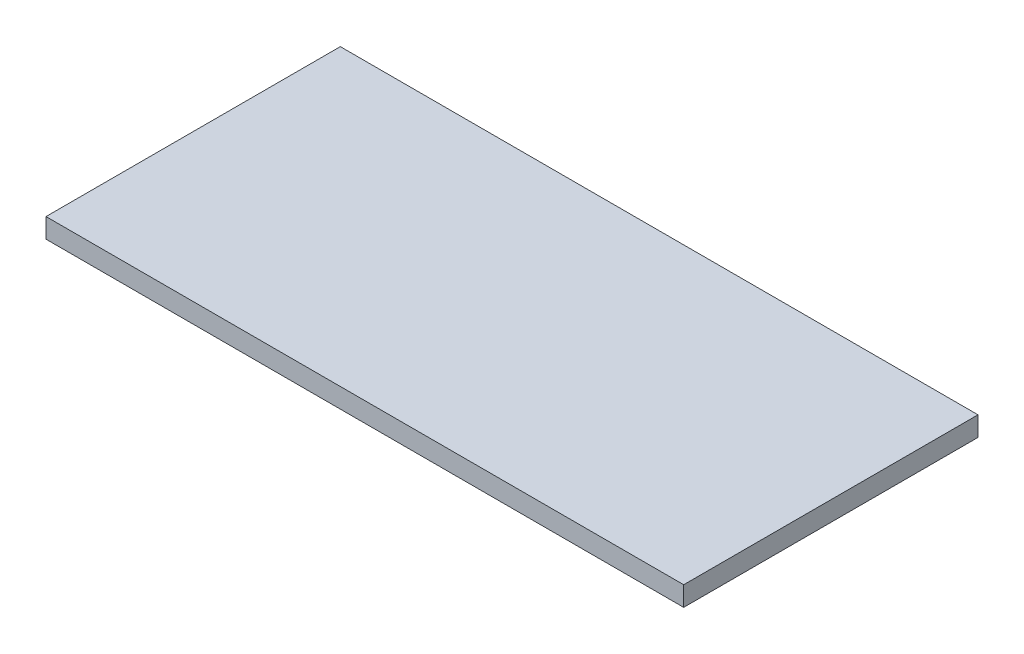
ISO-10303-21;
HEADER;
FILE_DESCRIPTION(('STEP AP214'),'2;1');
FILE_NAME('part.step','',(''),(''),'','','');
FILE_SCHEMA(('AUTOMOTIVE_DESIGN { 1 0 10303 214 1 1 1 1 }'));
ENDSEC;
DATA;
#1=APPLICATION_CONTEXT('core data for automotive mechanical design processes');
#2=APPLICATION_PROTOCOL_DEFINITION('international standard','automotive_design',2000,#1);
#3=PRODUCT_CONTEXT('',#1,'mechanical');
#4=PRODUCT('Part','Part','',(#3));
#5=PRODUCT_RELATED_PRODUCT_CATEGORY('part','',(#4));
#6=PRODUCT_DEFINITION_FORMATION('','',#4);
#7=PRODUCT_DEFINITION_CONTEXT('part definition',#1,'design');
#8=PRODUCT_DEFINITION('design','',#6,#7);
#9=PRODUCT_DEFINITION_SHAPE('','',#8);
#10=(LENGTH_UNIT() NAMED_UNIT(*) SI_UNIT(.MILLI.,.METRE.));
#11=(NAMED_UNIT(*) PLANE_ANGLE_UNIT() SI_UNIT($,.RADIAN.));
#12=(NAMED_UNIT(*) SI_UNIT($,.STERADIAN.) SOLID_ANGLE_UNIT());
#13=UNCERTAINTY_MEASURE_WITH_UNIT(LENGTH_MEASURE(1.E-05),#10,'distance_accuracy_value','');
#14=(GEOMETRIC_REPRESENTATION_CONTEXT(3) GLOBAL_UNCERTAINTY_ASSIGNED_CONTEXT((#13)) GLOBAL_UNIT_ASSIGNED_CONTEXT((#10,
#11,#12)) REPRESENTATION_CONTEXT('',''));
#15=CARTESIAN_POINT('',(0.,0.,0.));
#16=DIRECTION('',(0.,0.,1.));
#17=DIRECTION('',(1.,0.,0.));
#18=AXIS2_PLACEMENT_3D('',#15,#16,#17);
#19=CARTESIAN_POINT('',(0.,2.,0.));
#20=DIRECTION('',(-1.,0.,0.));
#21=DIRECTION('',(0.,0.,1.));
#22=AXIS2_PLACEMENT_3D('',#19,#20,#21);
#23=PLANE('',#22);
#24=DIRECTION('',(0.,0.,-1.));
#25=VECTOR('',#24,1.);
#26=CARTESIAN_POINT('',(0.,0.,0.));
#27=LINE('',#26,#25);
#28=CARTESIAN_POINT('',(0.,0.,30.));
#29=VERTEX_POINT('',#28);
#30=CARTESIAN_POINT('',(0.,0.,0.));
#31=VERTEX_POINT('',#30);
#32=EDGE_CURVE('E96',#29,#31,#27,.T.);
#33=ORIENTED_EDGE('',*,*,#32,.T.);
#34=DIRECTION('',(0.,-1.,0.));
#35=VECTOR('',#34,1.);
#36=CARTESIAN_POINT('',(0.,2.,0.));
#37=LINE('',#36,#35);
#38=CARTESIAN_POINT('',(0.,2.,0.));
#39=VERTEX_POINT('',#38);
#40=EDGE_CURVE('E11',#39,#31,#37,.T.);
#41=ORIENTED_EDGE('',*,*,#40,.F.);
#42=DIRECTION('',(0.,0.,-1.));
#43=VECTOR('',#42,1.);
#44=CARTESIAN_POINT('',(0.,2.,0.));
#45=LINE('',#44,#43);
#46=CARTESIAN_POINT('',(0.,2.,30.));
#47=VERTEX_POINT('',#46);
#48=EDGE_CURVE('E84',#47,#39,#45,.T.);
#49=ORIENTED_EDGE('',*,*,#48,.F.);
#50=DIRECTION('',(0.,-1.,0.));
#51=VECTOR('',#50,1.);
#52=CARTESIAN_POINT('',(0.,2.,30.));
#53=LINE('',#52,#51);
#54=EDGE_CURVE('E92',#47,#29,#53,.T.);
#55=ORIENTED_EDGE('',*,*,#54,.T.);
#56=EDGE_LOOP('',(#33,#41,#49,#55));
#57=FACE_BOUND('',#56,.T.);
#58=ADVANCED_FACE('F33',(#57),#23,.F.);
#59=CARTESIAN_POINT('',(0.,2.,0.));
#60=DIRECTION('',(0.,0.,1.));
#61=DIRECTION('',(1.,0.,0.));
#62=AXIS2_PLACEMENT_3D('',#59,#60,#61);
#63=PLANE('',#62);
#64=DIRECTION('',(-1.,0.,0.));
#65=VECTOR('',#64,1.);
#66=CARTESIAN_POINT('',(0.,0.,0.));
#67=LINE('',#66,#65);
#68=CARTESIAN_POINT('',(-65.,0.,0.));
#69=VERTEX_POINT('',#68);
#70=EDGE_CURVE('E88',#31,#69,#67,.T.);
#71=ORIENTED_EDGE('',*,*,#70,.T.);
#72=DIRECTION('',(0.,-1.,0.));
#73=VECTOR('',#72,1.);
#74=CARTESIAN_POINT('',(-65.,2.,0.));
#75=LINE('',#74,#73);
#76=CARTESIAN_POINT('',(-65.,2.,0.));
#77=VERTEX_POINT('',#76);
#78=EDGE_CURVE('E41',#77,#69,#75,.T.);
#79=ORIENTED_EDGE('',*,*,#78,.F.);
#80=DIRECTION('',(-1.,0.,0.));
#81=VECTOR('',#80,1.);
#82=CARTESIAN_POINT('',(0.,2.,0.));
#83=LINE('',#82,#81);
#84=EDGE_CURVE('E79',#39,#77,#83,.T.);
#85=ORIENTED_EDGE('',*,*,#84,.F.);
#86=ORIENTED_EDGE('',*,*,#40,.T.);
#87=EDGE_LOOP('',(#71,#79,#85,#86));
#88=FACE_BOUND('',#87,.T.);
#89=ADVANCED_FACE('F87',(#88),#63,.F.);
#90=CARTESIAN_POINT('',(-65.,2.,0.));
#91=DIRECTION('',(1.,0.,0.));
#92=DIRECTION('',(0.,0.,-1.));
#93=AXIS2_PLACEMENT_3D('',#90,#91,#92);
#94=PLANE('',#93);
#95=DIRECTION('',(0.,0.,1.));
#96=VECTOR('',#95,1.);
#97=CARTESIAN_POINT('',(-65.,0.,0.));
#98=LINE('',#97,#96);
#99=CARTESIAN_POINT('',(-65.,0.,30.));
#100=VERTEX_POINT('',#99);
#101=EDGE_CURVE('E66',#69,#100,#98,.T.);
#102=ORIENTED_EDGE('',*,*,#101,.T.);
#103=DIRECTION('',(0.,-1.,0.));
#104=VECTOR('',#103,1.);
#105=CARTESIAN_POINT('',(-65.,2.,30.));
#106=LINE('',#105,#104);
#107=CARTESIAN_POINT('',(-65.,2.,30.));
#108=VERTEX_POINT('',#107);
#109=EDGE_CURVE('E89',#108,#100,#106,.T.);
#110=ORIENTED_EDGE('',*,*,#109,.F.);
#111=DIRECTION('',(0.,0.,1.));
#112=VECTOR('',#111,1.);
#113=CARTESIAN_POINT('',(-65.,2.,0.));
#114=LINE('',#113,#112);
#115=EDGE_CURVE('E82',#77,#108,#114,.T.);
#116=ORIENTED_EDGE('',*,*,#115,.F.);
#117=ORIENTED_EDGE('',*,*,#78,.T.);
#118=EDGE_LOOP('',(#102,#110,#116,#117));
#119=FACE_BOUND('',#118,.T.);
#120=ADVANCED_FACE('F90',(#119),#94,.F.);
#121=CARTESIAN_POINT('',(0.,2.,30.));
#122=DIRECTION('',(0.,0.,-1.));
#123=DIRECTION('',(-1.,0.,0.));
#124=AXIS2_PLACEMENT_3D('',#121,#122,#123);
#125=PLANE('',#124);
#126=DIRECTION('',(1.,0.,0.));
#127=VECTOR('',#126,1.);
#128=CARTESIAN_POINT('',(0.,0.,30.));
#129=LINE('',#128,#127);
#130=EDGE_CURVE('E72',#100,#29,#129,.T.);
#131=ORIENTED_EDGE('',*,*,#130,.T.);
#132=ORIENTED_EDGE('',*,*,#54,.F.);
#133=DIRECTION('',(1.,0.,0.));
#134=VECTOR('',#133,1.);
#135=CARTESIAN_POINT('',(0.,2.,30.));
#136=LINE('',#135,#134);
#137=EDGE_CURVE('E49',#108,#47,#136,.T.);
#138=ORIENTED_EDGE('',*,*,#137,.F.);
#139=ORIENTED_EDGE('',*,*,#109,.T.);
#140=EDGE_LOOP('',(#131,#132,#138,#139));
#141=FACE_BOUND('',#140,.T.);
#142=ADVANCED_FACE('F103',(#141),#125,.F.);
#143=CARTESIAN_POINT('',(0.,2.,0.));
#144=DIRECTION('',(0.,-1.,0.));
#145=DIRECTION('',(0.,0.,-1.));
#146=AXIS2_PLACEMENT_3D('',#143,#144,#145);
#147=PLANE('',#146);
#148=ORIENTED_EDGE('',*,*,#48,.T.);
#149=ORIENTED_EDGE('',*,*,#84,.T.);
#150=ORIENTED_EDGE('',*,*,#115,.T.);
#151=ORIENTED_EDGE('',*,*,#137,.T.);
#152=EDGE_LOOP('',(#148,#149,#150,#151));
#153=FACE_BOUND('',#152,.T.);
#154=ADVANCED_FACE('F80',(#153),#147,.F.);
#155=CARTESIAN_POINT('',(0.,0.,0.));
#156=DIRECTION('',(0.,-1.,0.));
#157=DIRECTION('',(0.,0.,-1.));
#158=AXIS2_PLACEMENT_3D('',#155,#156,#157);
#159=PLANE('',#158);
#160=ORIENTED_EDGE('',*,*,#32,.F.);
#161=ORIENTED_EDGE('',*,*,#130,.F.);
#162=ORIENTED_EDGE('',*,*,#101,.F.);
#163=ORIENTED_EDGE('',*,*,#70,.F.);
#164=EDGE_LOOP('',(#160,#161,#162,#163));
#165=FACE_BOUND('',#164,.T.);
#166=ADVANCED_FACE('F106',(#165),#159,.T.);
#167=CLOSED_SHELL('',(#58,#89,#120,#142,#154,#166));
#168=MANIFOLD_SOLID_BREP('B2',#167);
#169=ADVANCED_BREP_SHAPE_REPRESENTATION('',(#18,#168),#14);
#170=SHAPE_DEFINITION_REPRESENTATION(#9,#169);
ENDSEC;
END-ISO-10303-21;
